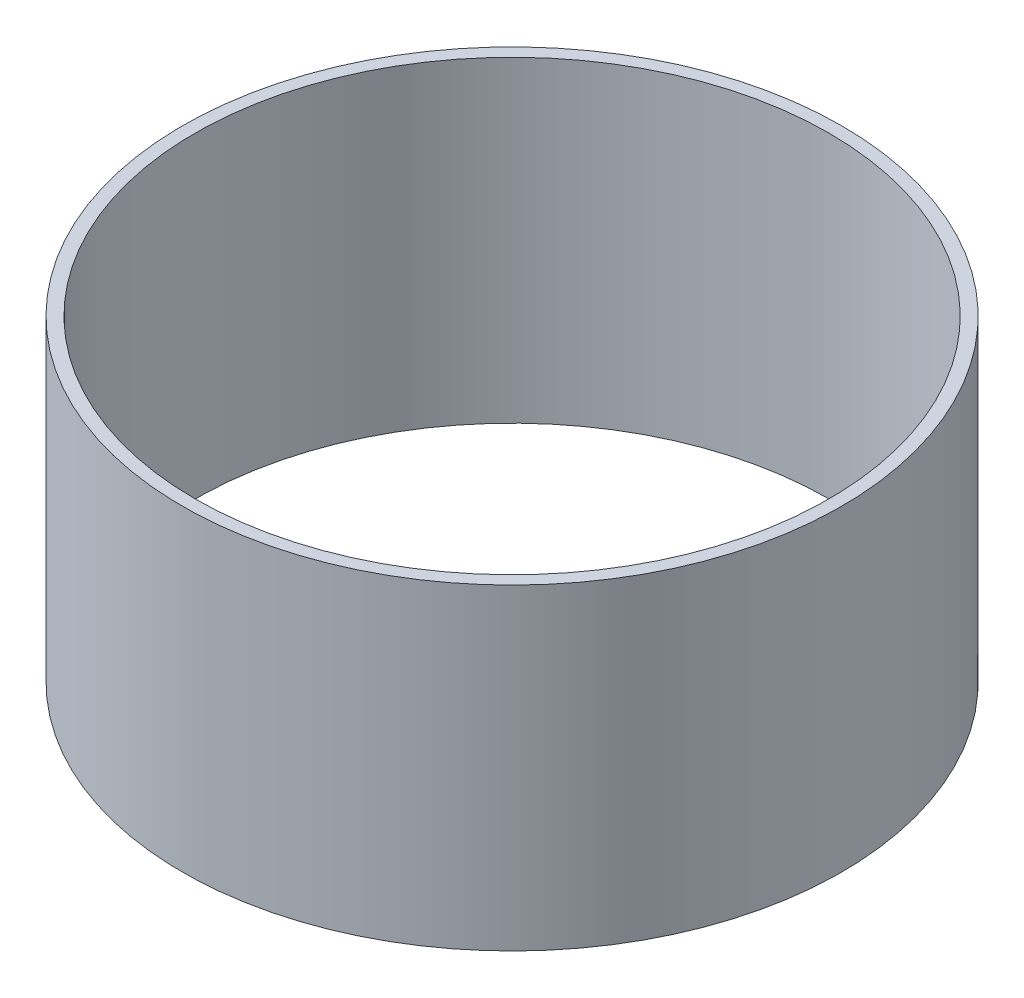
ISO-10303-21;
HEADER;
FILE_DESCRIPTION(('STEP AP214'),'2;1');
FILE_NAME('part.step','',(''),(''),'','','');
FILE_SCHEMA(('AUTOMOTIVE_DESIGN { 1 0 10303 214 1 1 1 1 }'));
ENDSEC;
DATA;
#1=APPLICATION_CONTEXT('core data for automotive mechanical design processes');
#2=APPLICATION_PROTOCOL_DEFINITION('international standard','automotive_design',2000,#1);
#3=PRODUCT_CONTEXT('',#1,'mechanical');
#4=PRODUCT('Part','Part','',(#3));
#5=PRODUCT_RELATED_PRODUCT_CATEGORY('part','',(#4));
#6=PRODUCT_DEFINITION_FORMATION('','',#4);
#7=PRODUCT_DEFINITION_CONTEXT('part definition',#1,'design');
#8=PRODUCT_DEFINITION('design','',#6,#7);
#9=PRODUCT_DEFINITION_SHAPE('','',#8);
#10=(LENGTH_UNIT() NAMED_UNIT(*) SI_UNIT(.MILLI.,.METRE.));
#11=(NAMED_UNIT(*) PLANE_ANGLE_UNIT() SI_UNIT($,.RADIAN.));
#12=(NAMED_UNIT(*) SI_UNIT($,.STERADIAN.) SOLID_ANGLE_UNIT());
#13=UNCERTAINTY_MEASURE_WITH_UNIT(LENGTH_MEASURE(1.E-05),#10,'distance_accuracy_value','');
#14=(GEOMETRIC_REPRESENTATION_CONTEXT(3) GLOBAL_UNCERTAINTY_ASSIGNED_CONTEXT((#13)) GLOBAL_UNIT_ASSIGNED_CONTEXT((#10,
#11,#12)) REPRESENTATION_CONTEXT('',''));
#15=CARTESIAN_POINT('',(0.,0.,0.));
#16=DIRECTION('',(0.,0.,1.));
#17=DIRECTION('',(1.,0.,0.));
#18=AXIS2_PLACEMENT_3D('',#15,#16,#17);
#19=CARTESIAN_POINT('',(0.,38.1,0.));
#20=DIRECTION('',(0.,1.,0.));
#21=DIRECTION('',(0.,0.,1.));
#22=AXIS2_PLACEMENT_3D('',#19,#20,#21);
#23=PLANE('',#22);
#24=CARTESIAN_POINT('',(0.,38.1,0.));
#25=DIRECTION('',(0.,1.,0.));
#26=DIRECTION('',(0.,0.,1.));
#27=AXIS2_PLACEMENT_3D('',#24,#25,#26);
#28=CIRCLE('',#27,39.624);
#29=CARTESIAN_POINT('',(0.,38.1,-39.624));
#30=VERTEX_POINT('',#29);
#31=EDGE_CURVE('E10',#30,#30,#28,.T.);
#32=ORIENTED_EDGE('',*,*,#31,.T.);
#33=EDGE_LOOP('',(#32));
#34=FACE_BOUND('',#33,.T.);
#35=CARTESIAN_POINT('',(0.,38.1,0.));
#36=DIRECTION('',(0.,1.,0.));
#37=DIRECTION('',(0.,0.,1.));
#38=AXIS2_PLACEMENT_3D('',#35,#36,#37);
#39=CIRCLE('',#38,38.1);
#40=CARTESIAN_POINT('',(0.,38.1,-38.1));
#41=VERTEX_POINT('',#40);
#42=EDGE_CURVE('E56',#41,#41,#39,.T.);
#43=ORIENTED_EDGE('',*,*,#42,.F.);
#44=EDGE_LOOP('',(#43));
#45=FACE_BOUND('',#44,.T.);
#46=ADVANCED_FACE('F43',(#34,#45),#23,.T.);
#47=CARTESIAN_POINT('',(0.,0.,0.));
#48=DIRECTION('',(0.,1.,0.));
#49=DIRECTION('',(0.,0.,1.));
#50=AXIS2_PLACEMENT_3D('',#47,#48,#49);
#51=PLANE('',#50);
#52=CARTESIAN_POINT('',(0.,0.,0.));
#53=DIRECTION('',(0.,1.,0.));
#54=DIRECTION('',(0.,0.,1.));
#55=AXIS2_PLACEMENT_3D('',#52,#53,#54);
#56=CIRCLE('',#55,39.624);
#57=CARTESIAN_POINT('',(0.,0.,-39.624));
#58=VERTEX_POINT('',#57);
#59=EDGE_CURVE('E47',#58,#58,#56,.T.);
#60=ORIENTED_EDGE('',*,*,#59,.F.);
#61=EDGE_LOOP('',(#60));
#62=FACE_BOUND('',#61,.T.);
#63=CARTESIAN_POINT('',(0.,0.,0.));
#64=DIRECTION('',(0.,1.,0.));
#65=DIRECTION('',(0.,0.,1.));
#66=AXIS2_PLACEMENT_3D('',#63,#64,#65);
#67=CIRCLE('',#66,38.1);
#68=CARTESIAN_POINT('',(0.,0.,-38.1));
#69=VERTEX_POINT('',#68);
#70=EDGE_CURVE('E58',#69,#69,#67,.T.);
#71=ORIENTED_EDGE('',*,*,#70,.T.);
#72=EDGE_LOOP('',(#71));
#73=FACE_BOUND('',#72,.T.);
#74=ADVANCED_FACE('F70',(#62,#73),#51,.F.);
#75=CARTESIAN_POINT('',(0.,38.1,0.));
#76=DIRECTION('',(0.,-1.,0.));
#77=DIRECTION('',(0.,0.,-1.));
#78=AXIS2_PLACEMENT_3D('',#75,#76,#77);
#79=CYLINDRICAL_SURFACE('',#78,39.624);
#80=CARTESIAN_POINT('',(0.,38.1,-39.624));
#81=CARTESIAN_POINT('',(0.,37.703125,-39.624));
#82=CARTESIAN_POINT('',(0.,37.30625,-39.624));
#83=CARTESIAN_POINT('',(0.,36.5125,-39.624));
#84=CARTESIAN_POINT('',(0.,36.115625,-39.624));
#85=CARTESIAN_POINT('',(0.,35.321875,-39.624));
#86=CARTESIAN_POINT('',(0.,34.925,-39.624));
#87=CARTESIAN_POINT('',(0.,34.13125,-39.624));
#88=CARTESIAN_POINT('',(0.,33.734375,-39.624));
#89=CARTESIAN_POINT('',(0.,32.940625,-39.624));
#90=CARTESIAN_POINT('',(0.,32.54375,-39.624));
#91=CARTESIAN_POINT('',(0.,31.75,-39.624));
#92=CARTESIAN_POINT('',(0.,31.353125,-39.624));
#93=CARTESIAN_POINT('',(0.,30.559375,-39.624));
#94=CARTESIAN_POINT('',(0.,30.1625,-39.624));
#95=CARTESIAN_POINT('',(0.,29.36875,-39.624));
#96=CARTESIAN_POINT('',(0.,28.971875,-39.624));
#97=CARTESIAN_POINT('',(0.,28.178125,-39.624));
#98=CARTESIAN_POINT('',(0.,27.78125,-39.624));
#99=CARTESIAN_POINT('',(0.,26.9875,-39.624));
#100=CARTESIAN_POINT('',(0.,26.590625,-39.624));
#101=CARTESIAN_POINT('',(0.,25.796875,-39.624));
#102=CARTESIAN_POINT('',(0.,25.4,-39.624));
#103=CARTESIAN_POINT('',(0.,24.60625,-39.624));
#104=CARTESIAN_POINT('',(0.,24.209375,-39.624));
#105=CARTESIAN_POINT('',(0.,23.415625,-39.624));
#106=CARTESIAN_POINT('',(0.,23.01875,-39.624));
#107=CARTESIAN_POINT('',(0.,22.225,-39.624));
#108=CARTESIAN_POINT('',(0.,21.828125,-39.624));
#109=CARTESIAN_POINT('',(0.,21.034375,-39.624));
#110=CARTESIAN_POINT('',(0.,20.6375,-39.624));
#111=CARTESIAN_POINT('',(0.,19.84375,-39.624));
#112=CARTESIAN_POINT('',(0.,19.446875,-39.624));
#113=CARTESIAN_POINT('',(0.,18.653125,-39.624));
#114=CARTESIAN_POINT('',(0.,18.25625,-39.624));
#115=CARTESIAN_POINT('',(0.,17.4625,-39.624));
#116=CARTESIAN_POINT('',(0.,17.065625,-39.624));
#117=CARTESIAN_POINT('',(0.,16.271875,-39.624));
#118=CARTESIAN_POINT('',(0.,15.875,-39.624));
#119=CARTESIAN_POINT('',(0.,15.08125,-39.624));
#120=CARTESIAN_POINT('',(0.,14.684375,-39.624));
#121=CARTESIAN_POINT('',(0.,13.890625,-39.624));
#122=CARTESIAN_POINT('',(0.,13.49375,-39.624));
#123=CARTESIAN_POINT('',(0.,12.7,-39.624));
#124=CARTESIAN_POINT('',(0.,12.303125,-39.624));
#125=CARTESIAN_POINT('',(0.,11.509375,-39.624));
#126=CARTESIAN_POINT('',(0.,11.1125,-39.624));
#127=CARTESIAN_POINT('',(0.,10.31875,-39.624));
#128=CARTESIAN_POINT('',(0.,9.92187499999999,-39.624));
#129=CARTESIAN_POINT('',(0.,9.128125,-39.624));
#130=CARTESIAN_POINT('',(0.,8.73124999999999,-39.624));
#131=CARTESIAN_POINT('',(0.,7.93749999999999,-39.624));
#132=CARTESIAN_POINT('',(0.,7.54062499999999,-39.624));
#133=CARTESIAN_POINT('',(0.,6.746875,-39.624));
#134=CARTESIAN_POINT('',(0.,6.35,-39.624));
#135=CARTESIAN_POINT('',(0.,5.55625,-39.624));
#136=CARTESIAN_POINT('',(0.,5.159375,-39.624));
#137=CARTESIAN_POINT('',(0.,4.365625,-39.624));
#138=CARTESIAN_POINT('',(0.,3.96875,-39.624));
#139=CARTESIAN_POINT('',(0.,3.175,-39.624));
#140=CARTESIAN_POINT('',(0.,2.778125,-39.624));
#141=CARTESIAN_POINT('',(0.,1.984375,-39.624));
#142=CARTESIAN_POINT('',(0.,1.5875,-39.624));
#143=CARTESIAN_POINT('',(0.,0.79375,-39.624));
#144=CARTESIAN_POINT('',(0.,0.396875,-39.624));
#145=CARTESIAN_POINT('',(0.,0.,-39.624));
#146=B_SPLINE_CURVE_WITH_KNOTS('',3,(#80,#81,#82,#83,#84,#85,#86,#87,#88,#89,#90,#91,#92,#93,
#94,#95,#96,#97,#98,#99,#100,#101,#102,#103,#104,#105,#106,#107,#108,#109,#110,#111,#112,#113,
#114,#115,#116,#117,#118,#119,#120,#121,#122,#123,#124,#125,#126,#127,#128,#129,#130,#131,#132,
#133,#134,#135,#136,#137,#138,#139,#140,#141,#142,#143,#144,#145),.UNSPECIFIED.,.F.,.F.,(4,2,2,
2,2,2,2,2,2,2,2,2,2,2,2,2,2,2,2,2,2,2,2,2,2,2,2,2,2,2,2,2,4),(0.,1.190625,2.38125,3.571875,
4.7625,5.953125,7.14375,8.334375,9.52500000000001,10.715625,11.90625,13.096875,14.2875,
15.478125,16.66875,17.859375,19.05,20.240625,21.43125,22.621875,23.8125,25.003125,26.19375,
27.384375,28.575,29.765625,30.95625,32.146875,33.3375,34.528125,35.71875,36.909375,38.1),.UNSPECIFIED.);
#147=EDGE_CURVE('BSEAM45',#30,#58,#146,.T.);
#148=ORIENTED_EDGE('',*,*,#31,.F.);
#149=ORIENTED_EDGE('',*,*,#59,.T.);
#150=ORIENTED_EDGE('',*,*,#147,.T.);
#151=ORIENTED_EDGE('',*,*,#147,.F.);
#152=EDGE_LOOP('',(#148,#150,#149,#151));
#153=FACE_BOUND('',#152,.T.);
#154=ADVANCED_FACE('F45',(#153),#79,.T.);
#155=CARTESIAN_POINT('',(0.,38.1,0.));
#156=DIRECTION('',(0.,-1.,0.));
#157=DIRECTION('',(0.,0.,-1.));
#158=AXIS2_PLACEMENT_3D('',#155,#156,#157);
#159=CYLINDRICAL_SURFACE('',#158,38.1);
#160=CARTESIAN_POINT('',(0.,38.1,-38.1));
#161=CARTESIAN_POINT('',(0.,37.703125,-38.1));
#162=CARTESIAN_POINT('',(0.,37.30625,-38.1));
#163=CARTESIAN_POINT('',(0.,36.5125,-38.1));
#164=CARTESIAN_POINT('',(0.,36.115625,-38.1));
#165=CARTESIAN_POINT('',(0.,35.321875,-38.1));
#166=CARTESIAN_POINT('',(0.,34.925,-38.1));
#167=CARTESIAN_POINT('',(0.,34.13125,-38.1));
#168=CARTESIAN_POINT('',(0.,33.734375,-38.1));
#169=CARTESIAN_POINT('',(0.,32.940625,-38.1));
#170=CARTESIAN_POINT('',(0.,32.54375,-38.1));
#171=CARTESIAN_POINT('',(0.,31.75,-38.1));
#172=CARTESIAN_POINT('',(0.,31.353125,-38.1));
#173=CARTESIAN_POINT('',(0.,30.559375,-38.1));
#174=CARTESIAN_POINT('',(0.,30.1625,-38.1));
#175=CARTESIAN_POINT('',(0.,29.36875,-38.1));
#176=CARTESIAN_POINT('',(0.,28.971875,-38.1));
#177=CARTESIAN_POINT('',(0.,28.178125,-38.1));
#178=CARTESIAN_POINT('',(0.,27.78125,-38.1));
#179=CARTESIAN_POINT('',(0.,26.9875,-38.1));
#180=CARTESIAN_POINT('',(0.,26.590625,-38.1));
#181=CARTESIAN_POINT('',(0.,25.796875,-38.1));
#182=CARTESIAN_POINT('',(0.,25.4,-38.1));
#183=CARTESIAN_POINT('',(0.,24.60625,-38.1));
#184=CARTESIAN_POINT('',(0.,24.209375,-38.1));
#185=CARTESIAN_POINT('',(0.,23.415625,-38.1));
#186=CARTESIAN_POINT('',(0.,23.01875,-38.1));
#187=CARTESIAN_POINT('',(0.,22.225,-38.1));
#188=CARTESIAN_POINT('',(0.,21.828125,-38.1));
#189=CARTESIAN_POINT('',(0.,21.034375,-38.1));
#190=CARTESIAN_POINT('',(0.,20.6375,-38.1));
#191=CARTESIAN_POINT('',(0.,19.84375,-38.1));
#192=CARTESIAN_POINT('',(0.,19.446875,-38.1));
#193=CARTESIAN_POINT('',(0.,18.653125,-38.1));
#194=CARTESIAN_POINT('',(0.,18.25625,-38.1));
#195=CARTESIAN_POINT('',(0.,17.4625,-38.1));
#196=CARTESIAN_POINT('',(0.,17.065625,-38.1));
#197=CARTESIAN_POINT('',(0.,16.271875,-38.1));
#198=CARTESIAN_POINT('',(0.,15.875,-38.1));
#199=CARTESIAN_POINT('',(0.,15.08125,-38.1));
#200=CARTESIAN_POINT('',(0.,14.684375,-38.1));
#201=CARTESIAN_POINT('',(0.,13.890625,-38.1));
#202=CARTESIAN_POINT('',(0.,13.49375,-38.1));
#203=CARTESIAN_POINT('',(0.,12.7,-38.1));
#204=CARTESIAN_POINT('',(0.,12.303125,-38.1));
#205=CARTESIAN_POINT('',(0.,11.509375,-38.1));
#206=CARTESIAN_POINT('',(0.,11.1125,-38.1));
#207=CARTESIAN_POINT('',(0.,10.31875,-38.1));
#208=CARTESIAN_POINT('',(0.,9.92187499999999,-38.1));
#209=CARTESIAN_POINT('',(0.,9.128125,-38.1));
#210=CARTESIAN_POINT('',(0.,8.73124999999999,-38.1));
#211=CARTESIAN_POINT('',(0.,7.93749999999999,-38.1));
#212=CARTESIAN_POINT('',(0.,7.54062499999999,-38.1));
#213=CARTESIAN_POINT('',(0.,6.746875,-38.1));
#214=CARTESIAN_POINT('',(0.,6.35,-38.1));
#215=CARTESIAN_POINT('',(0.,5.55625,-38.1));
#216=CARTESIAN_POINT('',(0.,5.159375,-38.1));
#217=CARTESIAN_POINT('',(0.,4.365625,-38.1));
#218=CARTESIAN_POINT('',(0.,3.96875,-38.1));
#219=CARTESIAN_POINT('',(0.,3.175,-38.1));
#220=CARTESIAN_POINT('',(0.,2.778125,-38.1));
#221=CARTESIAN_POINT('',(0.,1.984375,-38.1));
#222=CARTESIAN_POINT('',(0.,1.5875,-38.1));
#223=CARTESIAN_POINT('',(0.,0.79375,-38.1));
#224=CARTESIAN_POINT('',(0.,0.396875,-38.1));
#225=CARTESIAN_POINT('',(0.,0.,-38.1));
#226=B_SPLINE_CURVE_WITH_KNOTS('',3,(#160,#161,#162,#163,#164,#165,#166,#167,#168,#169,#170,
#171,#172,#173,#174,#175,#176,#177,#178,#179,#180,#181,#182,#183,#184,#185,#186,#187,#188,#189,
#190,#191,#192,#193,#194,#195,#196,#197,#198,#199,#200,#201,#202,#203,#204,#205,#206,#207,#208,
#209,#210,#211,#212,#213,#214,#215,#216,#217,#218,#219,#220,#221,#222,#223,#224,#225),
.UNSPECIFIED.,.F.,.F.,(4,2,2,2,2,2,2,2,2,2,2,2,2,2,2,2,2,2,2,2,2,2,2,2,2,2,2,2,2,2,2,2,4),(0.,
1.190625,2.38125,3.571875,4.7625,5.953125,7.14375,8.334375,9.52500000000001,10.715625,11.90625,
13.096875,14.2875,15.478125,16.66875,17.859375,19.05,20.240625,21.43125,22.621875,23.8125,
25.003125,26.19375,27.384375,28.575,29.765625,30.95625,32.146875,33.3375,34.528125,35.71875,
36.909375,38.1),.UNSPECIFIED.);
#227=EDGE_CURVE('BSEAM66',#41,#69,#226,.T.);
#228=ORIENTED_EDGE('',*,*,#42,.T.);
#229=ORIENTED_EDGE('',*,*,#70,.F.);
#230=ORIENTED_EDGE('',*,*,#227,.T.);
#231=ORIENTED_EDGE('',*,*,#227,.F.);
#232=EDGE_LOOP('',(#228,#230,#229,#231));
#233=FACE_BOUND('',#232,.T.);
#234=ADVANCED_FACE('F66',(#233),#159,.F.);
#235=CLOSED_SHELL('',(#46,#74,#154,#234));
#236=MANIFOLD_SOLID_BREP('B2',#235);
#237=ADVANCED_BREP_SHAPE_REPRESENTATION('',(#18,#236),#14);
#238=SHAPE_DEFINITION_REPRESENTATION(#9,#237);
ENDSEC;
END-ISO-10303-21;
